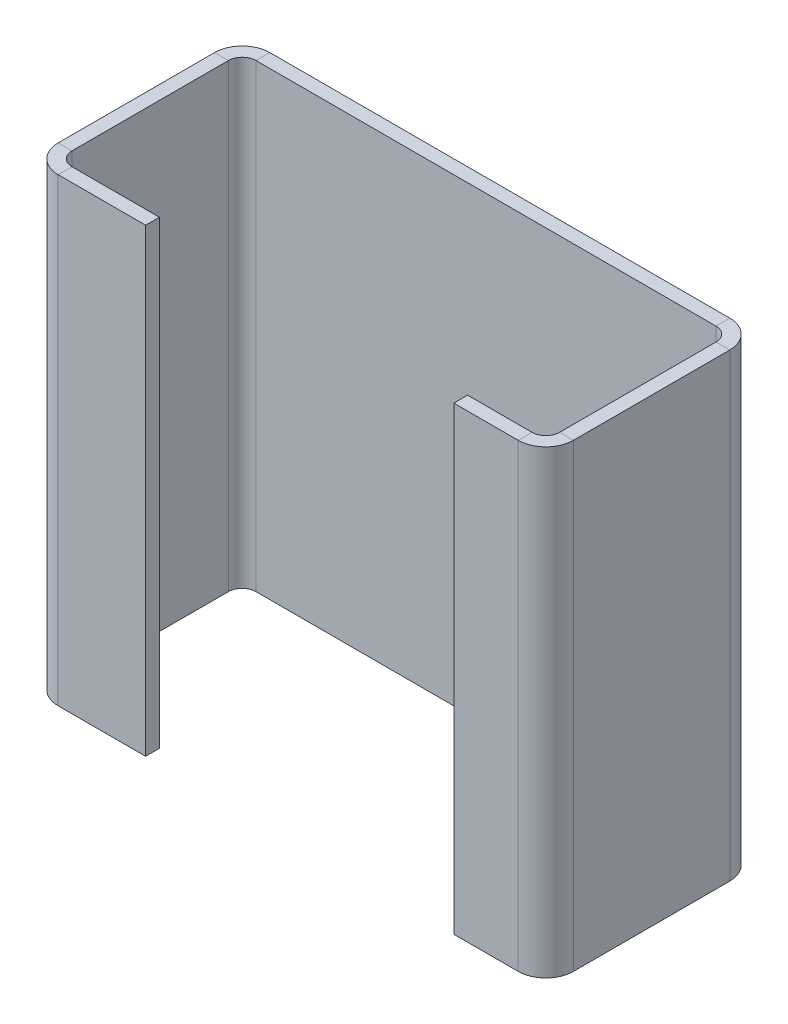
ISO-10303-21;
HEADER;
FILE_DESCRIPTION(('STEP AP214'),'2;1');
FILE_NAME('part.step','',(''),(''),'','','');
FILE_SCHEMA(('AUTOMOTIVE_DESIGN { 1 0 10303 214 1 1 1 1 }'));
ENDSEC;
DATA;
#1=APPLICATION_CONTEXT('core data for automotive mechanical design processes');
#2=APPLICATION_PROTOCOL_DEFINITION('international standard','automotive_design',2000,#1);
#3=PRODUCT_CONTEXT('',#1,'mechanical');
#4=PRODUCT('Part','Part','',(#3));
#5=PRODUCT_RELATED_PRODUCT_CATEGORY('part','',(#4));
#6=PRODUCT_DEFINITION_FORMATION('','',#4);
#7=PRODUCT_DEFINITION_CONTEXT('part definition',#1,'design');
#8=PRODUCT_DEFINITION('design','',#6,#7);
#9=PRODUCT_DEFINITION_SHAPE('','',#8);
#10=(LENGTH_UNIT() NAMED_UNIT(*) SI_UNIT(.MILLI.,.METRE.));
#11=(NAMED_UNIT(*) PLANE_ANGLE_UNIT() SI_UNIT($,.RADIAN.));
#12=(NAMED_UNIT(*) SI_UNIT($,.STERADIAN.) SOLID_ANGLE_UNIT());
#13=UNCERTAINTY_MEASURE_WITH_UNIT(LENGTH_MEASURE(1.E-05),#10,'distance_accuracy_value','');
#14=(GEOMETRIC_REPRESENTATION_CONTEXT(3) GLOBAL_UNCERTAINTY_ASSIGNED_CONTEXT((#13)) GLOBAL_UNIT_ASSIGNED_CONTEXT((#10,
#11,#12)) REPRESENTATION_CONTEXT('',''));
#15=CARTESIAN_POINT('',(0.,0.,0.));
#16=DIRECTION('',(0.,0.,1.));
#17=DIRECTION('',(1.,0.,0.));
#18=AXIS2_PLACEMENT_3D('',#15,#16,#17);
#19=CARTESIAN_POINT('',(-50.,50.,-3.));
#20=DIRECTION('',(0.,1.,0.));
#21=DIRECTION('',(0.,0.,1.));
#22=AXIS2_PLACEMENT_3D('',#19,#20,#21);
#23=PLANE('',#22);
#24=DIRECTION('',(-1.,0.,0.));
#25=VECTOR('',#24,1.);
#26=CARTESIAN_POINT('',(-50.,50.,0.));
#27=LINE('',#26,#25);
#28=CARTESIAN_POINT('',(50.,50.,0.));
#29=VERTEX_POINT('',#28);
#30=CARTESIAN_POINT('',(-50.,50.,0.));
#31=VERTEX_POINT('',#30);
#32=EDGE_CURVE('E161',#29,#31,#27,.T.);
#33=ORIENTED_EDGE('',*,*,#32,.F.);
#34=DIRECTION('',(0.,0.,1.));
#35=VECTOR('',#34,1.);
#36=CARTESIAN_POINT('',(50.,50.,-3.));
#37=LINE('',#36,#35);
#38=CARTESIAN_POINT('',(50.,50.,-3.00000000000003));
#39=VERTEX_POINT('',#38);
#40=EDGE_CURVE('E129',#39,#29,#37,.T.);
#41=ORIENTED_EDGE('',*,*,#40,.F.);
#42=DIRECTION('',(-1.,0.,0.));
#43=VECTOR('',#42,1.);
#44=CARTESIAN_POINT('',(-50.,50.,-3.));
#45=LINE('',#44,#43);
#46=CARTESIAN_POINT('',(-50.,50.,-3.));
#47=VERTEX_POINT('',#46);
#48=EDGE_CURVE('E163',#39,#47,#45,.T.);
#49=ORIENTED_EDGE('',*,*,#48,.T.);
#50=DIRECTION('',(0.,0.,1.));
#51=VECTOR('',#50,1.);
#52=CARTESIAN_POINT('',(-50.,50.,-3.));
#53=LINE('',#52,#51);
#54=EDGE_CURVE('E13',#47,#31,#53,.T.);
#55=ORIENTED_EDGE('',*,*,#54,.T.);
#56=EDGE_LOOP('',(#33,#41,#49,#55));
#57=FACE_BOUND('',#56,.T.);
#58=ADVANCED_FACE('F119',(#57),#23,.T.);
#59=CARTESIAN_POINT('',(-50.,-50.,-3.));
#60=DIRECTION('',(0.,-1.,0.));
#61=DIRECTION('',(1.,0.,0.));
#62=AXIS2_PLACEMENT_3D('',#59,#60,#61);
#63=PLANE('',#62);
#64=DIRECTION('',(1.,0.,0.));
#65=VECTOR('',#64,1.);
#66=CARTESIAN_POINT('',(-50.,-50.,0.));
#67=LINE('',#66,#65);
#68=CARTESIAN_POINT('',(-50.,-50.,0.));
#69=VERTEX_POINT('',#68);
#70=CARTESIAN_POINT('',(50.,-50.,0.));
#71=VERTEX_POINT('',#70);
#72=EDGE_CURVE('E184',#69,#71,#67,.T.);
#73=ORIENTED_EDGE('',*,*,#72,.F.);
#74=DIRECTION('',(0.,0.,1.));
#75=VECTOR('',#74,1.);
#76=CARTESIAN_POINT('',(-50.,-50.,-3.));
#77=LINE('',#76,#75);
#78=CARTESIAN_POINT('',(-50.,-50.,-3.));
#79=VERTEX_POINT('',#78);
#80=EDGE_CURVE('E123',#79,#69,#77,.T.);
#81=ORIENTED_EDGE('',*,*,#80,.F.);
#82=DIRECTION('',(1.,0.,0.));
#83=VECTOR('',#82,1.);
#84=CARTESIAN_POINT('',(-50.,-50.,-3.));
#85=LINE('',#84,#83);
#86=CARTESIAN_POINT('',(50.,-50.,-3.));
#87=VERTEX_POINT('',#86);
#88=EDGE_CURVE('E200',#79,#87,#85,.T.);
#89=ORIENTED_EDGE('',*,*,#88,.T.);
#90=DIRECTION('',(0.,0.,1.));
#91=VECTOR('',#90,1.);
#92=CARTESIAN_POINT('',(50.,-50.,-3.));
#93=LINE('',#92,#91);
#94=EDGE_CURVE('E209',#87,#71,#93,.T.);
#95=ORIENTED_EDGE('',*,*,#94,.T.);
#96=EDGE_LOOP('',(#73,#81,#89,#95));
#97=FACE_BOUND('',#96,.T.);
#98=ADVANCED_FACE('F121',(#97),#63,.T.);
#99=CARTESIAN_POINT('',(0.,0.,-3.));
#100=DIRECTION('',(0.,0.,1.));
#101=DIRECTION('',(1.,0.,0.));
#102=AXIS2_PLACEMENT_3D('',#99,#100,#101);
#103=PLANE('',#102);
#104=DIRECTION('',(0.,-1.,0.));
#105=VECTOR('',#104,1.);
#106=CARTESIAN_POINT('',(-50.,50.,-3.));
#107=LINE('',#106,#105);
#108=EDGE_CURVE('E138',#47,#79,#107,.T.);
#109=ORIENTED_EDGE('',*,*,#108,.F.);
#110=ORIENTED_EDGE('',*,*,#48,.F.);
#111=DIRECTION('',(0.,1.,0.));
#112=VECTOR('',#111,1.);
#113=CARTESIAN_POINT('',(50.,50.,-3.));
#114=LINE('',#113,#112);
#115=EDGE_CURVE('E203',#87,#39,#114,.T.);
#116=ORIENTED_EDGE('',*,*,#115,.F.);
#117=ORIENTED_EDGE('',*,*,#88,.F.);
#118=EDGE_LOOP('',(#109,#110,#116,#117));
#119=FACE_BOUND('',#118,.T.);
#120=ADVANCED_FACE('F543',(#119),#103,.F.);
#121=CARTESIAN_POINT('',(0.,0.,0.));
#122=DIRECTION('',(0.,0.,1.));
#123=DIRECTION('',(1.,0.,0.));
#124=AXIS2_PLACEMENT_3D('',#121,#122,#123);
#125=PLANE('',#124);
#126=DIRECTION('',(0.,-1.,0.));
#127=VECTOR('',#126,1.);
#128=CARTESIAN_POINT('',(-50.,50.,0.));
#129=LINE('',#128,#127);
#130=EDGE_CURVE('E171',#31,#69,#129,.T.);
#131=ORIENTED_EDGE('',*,*,#130,.T.);
#132=ORIENTED_EDGE('',*,*,#72,.T.);
#133=DIRECTION('',(0.,1.,0.));
#134=VECTOR('',#133,1.);
#135=CARTESIAN_POINT('',(50.,50.,0.));
#136=LINE('',#135,#134);
#137=EDGE_CURVE('E156',#71,#29,#136,.T.);
#138=ORIENTED_EDGE('',*,*,#137,.T.);
#139=ORIENTED_EDGE('',*,*,#32,.T.);
#140=EDGE_LOOP('',(#131,#132,#138,#139));
#141=FACE_BOUND('',#140,.T.);
#142=ADVANCED_FACE('F170',(#141),#125,.T.);
#143=CARTESIAN_POINT('',(-50.,50.,3.));
#144=DIRECTION('',(0.,1.,0.));
#145=DIRECTION('',(0.,0.,1.));
#146=AXIS2_PLACEMENT_3D('',#143,#144,#145);
#147=PLANE('',#146);
#148=DIRECTION('',(1.,0.,0.));
#149=VECTOR('',#148,1.);
#150=CARTESIAN_POINT('',(-56.,50.,2.99999999999998));
#151=LINE('',#150,#149);
#152=CARTESIAN_POINT('',(-53.,50.,2.99999999999999));
#153=VERTEX_POINT('',#152);
#154=CARTESIAN_POINT('',(-56.,50.,2.99999999999998));
#155=VERTEX_POINT('',#154);
#156=EDGE_CURVE('E190',#153,#155,#151,.F.);
#157=ORIENTED_EDGE('',*,*,#156,.F.);
#158=CARTESIAN_POINT('',(-50.,50.,3.));
#159=DIRECTION('',(0.,-1.,0.));
#160=DIRECTION('',(0.,0.,-1.));
#161=AXIS2_PLACEMENT_3D('',#158,#159,#160);
#162=CIRCLE('',#161,3.00000000000001);
#163=EDGE_CURVE('E180',#31,#153,#162,.F.);
#164=ORIENTED_EDGE('',*,*,#163,.F.);
#165=ORIENTED_EDGE('',*,*,#54,.F.);
#166=CARTESIAN_POINT('',(-50.,50.,3.));
#167=DIRECTION('',(0.,-1.,0.));
#168=DIRECTION('',(0.,0.,-1.));
#169=AXIS2_PLACEMENT_3D('',#166,#167,#168);
#170=CIRCLE('',#169,6.00000000000001);
#171=EDGE_CURVE('E185',#47,#155,#170,.F.);
#172=ORIENTED_EDGE('',*,*,#171,.T.);
#173=EDGE_LOOP('',(#157,#164,#165,#172));
#174=FACE_BOUND('',#173,.T.);
#175=ADVANCED_FACE('F188',(#174),#147,.T.);
#176=CARTESIAN_POINT('',(-50.,-50.,3.00000000000001));
#177=DIRECTION('',(0.,1.,0.));
#178=DIRECTION('',(0.,0.,1.));
#179=AXIS2_PLACEMENT_3D('',#176,#177,#178);
#180=PLANE('',#179);
#181=CARTESIAN_POINT('',(-50.,-50.,3.00000000000001));
#182=DIRECTION('',(0.,-1.,0.));
#183=DIRECTION('',(0.,0.,-1.));
#184=AXIS2_PLACEMENT_3D('',#181,#182,#183);
#185=CIRCLE('',#184,3.00000000000001);
#186=CARTESIAN_POINT('',(-53.,-50.,3.));
#187=VERTEX_POINT('',#186);
#188=EDGE_CURVE('E183',#187,#69,#185,.T.);
#189=ORIENTED_EDGE('',*,*,#188,.F.);
#190=DIRECTION('',(1.,0.,0.));
#191=VECTOR('',#190,1.);
#192=CARTESIAN_POINT('',(-53.,-50.,3.));
#193=LINE('',#192,#191);
#194=CARTESIAN_POINT('',(-56.,-50.,2.99999999999999));
#195=VERTEX_POINT('',#194);
#196=EDGE_CURVE('E232',#187,#195,#193,.F.);
#197=ORIENTED_EDGE('',*,*,#196,.T.);
#198=CARTESIAN_POINT('',(-50.,-50.,3.00000000000001));
#199=DIRECTION('',(0.,-1.,0.));
#200=DIRECTION('',(0.,0.,-1.));
#201=AXIS2_PLACEMENT_3D('',#198,#199,#200);
#202=CIRCLE('',#201,6.00000000000001);
#203=EDGE_CURVE('E191',#195,#79,#202,.T.);
#204=ORIENTED_EDGE('',*,*,#203,.T.);
#205=ORIENTED_EDGE('',*,*,#80,.T.);
#206=EDGE_LOOP('',(#189,#197,#204,#205));
#207=FACE_BOUND('',#206,.T.);
#208=ADVANCED_FACE('F214',(#207),#180,.F.);
#209=CARTESIAN_POINT('',(-50.,-50.,3.00000000000001));
#210=DIRECTION('',(0.,-1.,0.));
#211=DIRECTION('',(-1.,0.,0.));
#212=AXIS2_PLACEMENT_3D('',#209,#210,#211);
#213=CYLINDRICAL_SURFACE('',#212,6.00000000000001);
#214=ORIENTED_EDGE('',*,*,#108,.T.);
#215=ORIENTED_EDGE('',*,*,#203,.F.);
#216=DIRECTION('',(0.,-1.,0.));
#217=VECTOR('',#216,1.);
#218=CARTESIAN_POINT('',(-56.,50.,2.99999999999998));
#219=LINE('',#218,#217);
#220=EDGE_CURVE('E226',#195,#155,#219,.F.);
#221=ORIENTED_EDGE('',*,*,#220,.T.);
#222=ORIENTED_EDGE('',*,*,#171,.F.);
#223=EDGE_LOOP('',(#214,#215,#221,#222));
#224=FACE_BOUND('',#223,.T.);
#225=ADVANCED_FACE('F222',(#224),#213,.T.);
#226=CARTESIAN_POINT('',(-50.,-50.,3.00000000000001));
#227=DIRECTION('',(0.,-1.,0.));
#228=DIRECTION('',(-1.,0.,0.));
#229=AXIS2_PLACEMENT_3D('',#226,#227,#228);
#230=CYLINDRICAL_SURFACE('',#229,3.00000000000001);
#231=ORIENTED_EDGE('',*,*,#130,.F.);
#232=ORIENTED_EDGE('',*,*,#163,.T.);
#233=DIRECTION('',(0.,-1.,0.));
#234=VECTOR('',#233,1.);
#235=CARTESIAN_POINT('',(-53.,50.,2.99999999999999));
#236=LINE('',#235,#234);
#237=EDGE_CURVE('E229',#153,#187,#236,.T.);
#238=ORIENTED_EDGE('',*,*,#237,.T.);
#239=ORIENTED_EDGE('',*,*,#188,.T.);
#240=EDGE_LOOP('',(#231,#232,#238,#239));
#241=FACE_BOUND('',#240,.T.);
#242=ADVANCED_FACE('F177',(#241),#230,.F.);
#243=CARTESIAN_POINT('',(-56.,50.,0.));
#244=DIRECTION('',(0.,-1.,0.));
#245=DIRECTION('',(1.,0.,0.));
#246=AXIS2_PLACEMENT_3D('',#243,#244,#245);
#247=PLANE('',#246);
#248=ORIENTED_EDGE('',*,*,#156,.T.);
#249=DIRECTION('',(0.,0.,-1.));
#250=VECTOR('',#249,1.);
#251=CARTESIAN_POINT('',(-56.,50.,-1.88635233441175E-13));
#252=LINE('',#251,#250);
#253=CARTESIAN_POINT('',(-56.0000000000001,50.,37.));
#254=VERTEX_POINT('',#253);
#255=EDGE_CURVE('E244',#254,#155,#252,.T.);
#256=ORIENTED_EDGE('',*,*,#255,.F.);
#257=DIRECTION('',(1.,0.,0.));
#258=VECTOR('',#257,1.);
#259=CARTESIAN_POINT('',(-56.0000000000001,50.,37.));
#260=LINE('',#259,#258);
#261=CARTESIAN_POINT('',(-53.0000000000001,50.,37.));
#262=VERTEX_POINT('',#261);
#263=EDGE_CURVE('E253',#254,#262,#260,.T.);
#264=ORIENTED_EDGE('',*,*,#263,.T.);
#265=DIRECTION('',(0.,0.,1.));
#266=VECTOR('',#265,1.);
#267=CARTESIAN_POINT('',(-53.,50.,0.));
#268=LINE('',#267,#266);
#269=EDGE_CURVE('E235',#262,#153,#268,.F.);
#270=ORIENTED_EDGE('',*,*,#269,.T.);
#271=EDGE_LOOP('',(#248,#256,#264,#270));
#272=FACE_BOUND('',#271,.T.);
#273=ADVANCED_FACE('F491',(#272),#247,.F.);
#274=CARTESIAN_POINT('',(-56.0000000000001,-50.,37.));
#275=DIRECTION('',(0.,1.,0.));
#276=DIRECTION('',(-1.,0.,0.));
#277=AXIS2_PLACEMENT_3D('',#274,#275,#276);
#278=PLANE('',#277);
#279=ORIENTED_EDGE('',*,*,#196,.F.);
#280=DIRECTION('',(0.,0.,-1.));
#281=VECTOR('',#280,1.);
#282=CARTESIAN_POINT('',(-53.0000000000001,-50.,37.));
#283=LINE('',#282,#281);
#284=CARTESIAN_POINT('',(-53.0000000000001,-50.,37.));
#285=VERTEX_POINT('',#284);
#286=EDGE_CURVE('E238',#187,#285,#283,.F.);
#287=ORIENTED_EDGE('',*,*,#286,.T.);
#288=DIRECTION('',(1.,0.,0.));
#289=VECTOR('',#288,1.);
#290=CARTESIAN_POINT('',(-56.0000000000001,-50.,37.));
#291=LINE('',#290,#289);
#292=CARTESIAN_POINT('',(-56.0000000000002,-50.,37.));
#293=VERTEX_POINT('',#292);
#294=EDGE_CURVE('E195',#293,#285,#291,.T.);
#295=ORIENTED_EDGE('',*,*,#294,.F.);
#296=DIRECTION('',(0.,0.,1.));
#297=VECTOR('',#296,1.);
#298=CARTESIAN_POINT('',(-56.,-50.,-1.88635233441174E-13));
#299=LINE('',#298,#297);
#300=EDGE_CURVE('E247',#195,#293,#299,.T.);
#301=ORIENTED_EDGE('',*,*,#300,.F.);
#302=EDGE_LOOP('',(#279,#287,#295,#301));
#303=FACE_BOUND('',#302,.T.);
#304=ADVANCED_FACE('F559',(#303),#278,.F.);
#305=CARTESIAN_POINT('',(-56.,0.,-1.88635233441175E-13));
#306=DIRECTION('',(1.,0.,0.));
#307=DIRECTION('',(0.,0.,-1.));
#308=AXIS2_PLACEMENT_3D('',#305,#306,#307);
#309=PLANE('',#308);
#310=ORIENTED_EDGE('',*,*,#220,.F.);
#311=ORIENTED_EDGE('',*,*,#300,.T.);
#312=DIRECTION('',(0.,1.,0.));
#313=VECTOR('',#312,1.);
#314=CARTESIAN_POINT('',(-56.0000000000001,0.,37.));
#315=LINE('',#314,#313);
#316=EDGE_CURVE('E250',#293,#254,#315,.T.);
#317=ORIENTED_EDGE('',*,*,#316,.T.);
#318=ORIENTED_EDGE('',*,*,#255,.T.);
#319=EDGE_LOOP('',(#310,#311,#317,#318));
#320=FACE_BOUND('',#319,.T.);
#321=ADVANCED_FACE('F498',(#320),#309,.F.);
#322=CARTESIAN_POINT('',(-53.,0.,-1.78160789424645E-13));
#323=DIRECTION('',(1.,0.,0.));
#324=DIRECTION('',(0.,0.,-1.));
#325=AXIS2_PLACEMENT_3D('',#322,#323,#324);
#326=PLANE('',#325);
#327=ORIENTED_EDGE('',*,*,#286,.F.);
#328=ORIENTED_EDGE('',*,*,#237,.F.);
#329=ORIENTED_EDGE('',*,*,#269,.F.);
#330=DIRECTION('',(0.,-1.,0.));
#331=VECTOR('',#330,1.);
#332=CARTESIAN_POINT('',(-53.0000000000001,50.,37.));
#333=LINE('',#332,#331);
#334=EDGE_CURVE('E241',#285,#262,#333,.F.);
#335=ORIENTED_EDGE('',*,*,#334,.F.);
#336=EDGE_LOOP('',(#327,#328,#329,#335));
#337=FACE_BOUND('',#336,.T.);
#338=ADVANCED_FACE('F488',(#337),#326,.T.);
#339=CARTESIAN_POINT('',(50.,-50.,3.));
#340=DIRECTION('',(0.,-1.,0.));
#341=DIRECTION('',(0.,0.,-1.));
#342=AXIS2_PLACEMENT_3D('',#339,#340,#341);
#343=PLANE('',#342);
#344=DIRECTION('',(1.,0.,0.));
#345=VECTOR('',#344,1.);
#346=CARTESIAN_POINT('',(56.,-50.,2.99999999999998));
#347=LINE('',#346,#345);
#348=CARTESIAN_POINT('',(53.,-50.,2.99999999999999));
#349=VERTEX_POINT('',#348);
#350=CARTESIAN_POINT('',(56.,-50.,2.99999999999998));
#351=VERTEX_POINT('',#350);
#352=EDGE_CURVE('E270',#349,#351,#347,.T.);
#353=ORIENTED_EDGE('',*,*,#352,.F.);
#354=CARTESIAN_POINT('',(50.,-50.,3.));
#355=DIRECTION('',(0.,1.,0.));
#356=DIRECTION('',(0.,0.,1.));
#357=AXIS2_PLACEMENT_3D('',#354,#355,#356);
#358=CIRCLE('',#357,3.00000000000001);
#359=EDGE_CURVE('E261',#71,#349,#358,.F.);
#360=ORIENTED_EDGE('',*,*,#359,.F.);
#361=ORIENTED_EDGE('',*,*,#94,.F.);
#362=CARTESIAN_POINT('',(50.,-50.,3.));
#363=DIRECTION('',(0.,1.,0.));
#364=DIRECTION('',(0.,0.,1.));
#365=AXIS2_PLACEMENT_3D('',#362,#363,#364);
#366=CIRCLE('',#365,6.00000000000001);
#367=EDGE_CURVE('E230',#87,#351,#366,.F.);
#368=ORIENTED_EDGE('',*,*,#367,.T.);
#369=EDGE_LOOP('',(#353,#360,#361,#368));
#370=FACE_BOUND('',#369,.T.);
#371=ADVANCED_FACE('F565',(#370),#343,.T.);
#372=CARTESIAN_POINT('',(50.,50.,2.99999999999998));
#373=DIRECTION('',(0.,-1.,0.));
#374=DIRECTION('',(0.,0.,-1.));
#375=AXIS2_PLACEMENT_3D('',#372,#373,#374);
#376=PLANE('',#375);
#377=CARTESIAN_POINT('',(50.,50.,2.99999999999998));
#378=DIRECTION('',(0.,1.,0.));
#379=DIRECTION('',(0.,0.,1.));
#380=AXIS2_PLACEMENT_3D('',#377,#378,#379);
#381=CIRCLE('',#380,3.00000000000001);
#382=CARTESIAN_POINT('',(53.,50.,2.99999999999997));
#383=VERTEX_POINT('',#382);
#384=EDGE_CURVE('E258',#383,#29,#381,.T.);
#385=ORIENTED_EDGE('',*,*,#384,.F.);
#386=DIRECTION('',(1.,0.,0.));
#387=VECTOR('',#386,1.);
#388=CARTESIAN_POINT('',(53.,50.,2.99999999999998));
#389=LINE('',#388,#387);
#390=CARTESIAN_POINT('',(56.,50.,2.99999999999997));
#391=VERTEX_POINT('',#390);
#392=EDGE_CURVE('E277',#383,#391,#389,.T.);
#393=ORIENTED_EDGE('',*,*,#392,.T.);
#394=CARTESIAN_POINT('',(50.,50.,2.99999999999998));
#395=DIRECTION('',(0.,1.,0.));
#396=DIRECTION('',(0.,0.,1.));
#397=AXIS2_PLACEMENT_3D('',#394,#395,#396);
#398=CIRCLE('',#397,6.00000000000001);
#399=EDGE_CURVE('E265',#391,#39,#398,.T.);
#400=ORIENTED_EDGE('',*,*,#399,.T.);
#401=ORIENTED_EDGE('',*,*,#40,.T.);
#402=EDGE_LOOP('',(#385,#393,#400,#401));
#403=FACE_BOUND('',#402,.T.);
#404=ADVANCED_FACE('F568',(#403),#376,.F.);
#405=CARTESIAN_POINT('',(50.,50.,2.99999999999998));
#406=DIRECTION('',(0.,1.,0.));
#407=DIRECTION('',(1.,0.,0.));
#408=AXIS2_PLACEMENT_3D('',#405,#406,#407);
#409=CYLINDRICAL_SURFACE('',#408,6.00000000000001);
#410=ORIENTED_EDGE('',*,*,#115,.T.);
#411=ORIENTED_EDGE('',*,*,#399,.F.);
#412=DIRECTION('',(0.,1.,0.));
#413=VECTOR('',#412,1.);
#414=CARTESIAN_POINT('',(56.,0.,2.99999999999997));
#415=LINE('',#414,#413);
#416=EDGE_CURVE('E280',#351,#391,#415,.T.);
#417=ORIENTED_EDGE('',*,*,#416,.F.);
#418=ORIENTED_EDGE('',*,*,#367,.F.);
#419=EDGE_LOOP('',(#410,#411,#417,#418));
#420=FACE_BOUND('',#419,.T.);
#421=ADVANCED_FACE('F571',(#420),#409,.T.);
#422=CARTESIAN_POINT('',(50.,50.,2.99999999999998));
#423=DIRECTION('',(0.,1.,0.));
#424=DIRECTION('',(1.,0.,0.));
#425=AXIS2_PLACEMENT_3D('',#422,#423,#424);
#426=CYLINDRICAL_SURFACE('',#425,3.00000000000001);
#427=ORIENTED_EDGE('',*,*,#137,.F.);
#428=ORIENTED_EDGE('',*,*,#359,.T.);
#429=DIRECTION('',(0.,-1.,0.));
#430=VECTOR('',#429,1.);
#431=CARTESIAN_POINT('',(53.,-50.,2.99999999999999));
#432=LINE('',#431,#430);
#433=EDGE_CURVE('E273',#349,#383,#432,.F.);
#434=ORIENTED_EDGE('',*,*,#433,.T.);
#435=ORIENTED_EDGE('',*,*,#384,.T.);
#436=EDGE_LOOP('',(#427,#428,#434,#435));
#437=FACE_BOUND('',#436,.T.);
#438=ADVANCED_FACE('F576',(#437),#426,.F.);
#439=CARTESIAN_POINT('',(56.,50.,0.));
#440=DIRECTION('',(0.,1.,0.));
#441=DIRECTION('',(-1.,0.,0.));
#442=AXIS2_PLACEMENT_3D('',#439,#440,#441);
#443=PLANE('',#442);
#444=DIRECTION('',(0.,0.,-1.));
#445=VECTOR('',#444,1.);
#446=CARTESIAN_POINT('',(56.,50.,0.));
#447=LINE('',#446,#445);
#448=CARTESIAN_POINT('',(56.0000000000001,50.,37.));
#449=VERTEX_POINT('',#448);
#450=EDGE_CURVE('E298',#449,#391,#447,.T.);
#451=ORIENTED_EDGE('',*,*,#450,.T.);
#452=ORIENTED_EDGE('',*,*,#392,.F.);
#453=DIRECTION('',(0.,0.,1.));
#454=VECTOR('',#453,1.);
#455=CARTESIAN_POINT('',(53.,50.,-1.68783905770716E-13));
#456=LINE('',#455,#454);
#457=CARTESIAN_POINT('',(53.0000000000001,50.,37.));
#458=VERTEX_POINT('',#457);
#459=EDGE_CURVE('E289',#458,#383,#456,.F.);
#460=ORIENTED_EDGE('',*,*,#459,.F.);
#461=DIRECTION('',(-1.,0.,0.));
#462=VECTOR('',#461,1.);
#463=CARTESIAN_POINT('',(56.0000000000001,50.,37.));
#464=LINE('',#463,#462);
#465=EDGE_CURVE('E262',#449,#458,#464,.T.);
#466=ORIENTED_EDGE('',*,*,#465,.F.);
#467=EDGE_LOOP('',(#451,#452,#460,#466));
#468=FACE_BOUND('',#467,.T.);
#469=ADVANCED_FACE('F579',(#468),#443,.T.);
#470=CARTESIAN_POINT('',(56.0000000000001,-50.,37.));
#471=DIRECTION('',(0.,-1.,0.));
#472=DIRECTION('',(1.,0.,0.));
#473=AXIS2_PLACEMENT_3D('',#470,#471,#472);
#474=PLANE('',#473);
#475=DIRECTION('',(0.,0.,-1.));
#476=VECTOR('',#475,1.);
#477=CARTESIAN_POINT('',(53.,-50.,-1.68783905770716E-13));
#478=LINE('',#477,#476);
#479=CARTESIAN_POINT('',(53.0000000000001,-50.,37.));
#480=VERTEX_POINT('',#479);
#481=EDGE_CURVE('E283',#349,#480,#478,.F.);
#482=ORIENTED_EDGE('',*,*,#481,.F.);
#483=ORIENTED_EDGE('',*,*,#352,.T.);
#484=DIRECTION('',(0.,0.,1.));
#485=VECTOR('',#484,1.);
#486=CARTESIAN_POINT('',(56.0000000000001,-50.,37.));
#487=LINE('',#486,#485);
#488=CARTESIAN_POINT('',(56.0000000000001,-50.,37.));
#489=VERTEX_POINT('',#488);
#490=EDGE_CURVE('E292',#351,#489,#487,.T.);
#491=ORIENTED_EDGE('',*,*,#490,.T.);
#492=DIRECTION('',(-1.,0.,0.));
#493=VECTOR('',#492,1.);
#494=CARTESIAN_POINT('',(56.0000000000001,-50.,37.));
#495=LINE('',#494,#493);
#496=EDGE_CURVE('E301',#489,#480,#495,.T.);
#497=ORIENTED_EDGE('',*,*,#496,.T.);
#498=EDGE_LOOP('',(#482,#483,#491,#497));
#499=FACE_BOUND('',#498,.T.);
#500=ADVANCED_FACE('F584',(#499),#474,.T.);
#501=CARTESIAN_POINT('',(56.,0.,-1.79258349787246E-13));
#502=DIRECTION('',(1.,0.,0.));
#503=DIRECTION('',(0.,0.,-1.));
#504=AXIS2_PLACEMENT_3D('',#501,#502,#503);
#505=PLANE('',#504);
#506=ORIENTED_EDGE('',*,*,#490,.F.);
#507=ORIENTED_EDGE('',*,*,#416,.T.);
#508=ORIENTED_EDGE('',*,*,#450,.F.);
#509=DIRECTION('',(0.,1.,0.));
#510=VECTOR('',#509,1.);
#511=CARTESIAN_POINT('',(56.0000000000001,50.,37.));
#512=LINE('',#511,#510);
#513=EDGE_CURVE('E295',#489,#449,#512,.T.);
#514=ORIENTED_EDGE('',*,*,#513,.F.);
#515=EDGE_LOOP('',(#506,#507,#508,#514));
#516=FACE_BOUND('',#515,.T.);
#517=ADVANCED_FACE('F587',(#516),#505,.T.);
#518=CARTESIAN_POINT('',(53.,0.,-1.68783905770716E-13));
#519=DIRECTION('',(1.,0.,0.));
#520=DIRECTION('',(0.,0.,-1.));
#521=AXIS2_PLACEMENT_3D('',#518,#519,#520);
#522=PLANE('',#521);
#523=ORIENTED_EDGE('',*,*,#433,.F.);
#524=ORIENTED_EDGE('',*,*,#481,.T.);
#525=DIRECTION('',(0.,-1.,0.));
#526=VECTOR('',#525,1.);
#527=CARTESIAN_POINT('',(53.0000000000001,0.,37.));
#528=LINE('',#527,#526);
#529=EDGE_CURVE('E286',#480,#458,#528,.F.);
#530=ORIENTED_EDGE('',*,*,#529,.T.);
#531=ORIENTED_EDGE('',*,*,#459,.T.);
#532=EDGE_LOOP('',(#523,#524,#530,#531));
#533=FACE_BOUND('',#532,.T.);
#534=ADVANCED_FACE('F592',(#533),#522,.F.);
#535=CARTESIAN_POINT('',(-50.0000000000002,50.,37.));
#536=DIRECTION('',(0.,1.,0.));
#537=DIRECTION('',(0.,0.,1.));
#538=AXIS2_PLACEMENT_3D('',#535,#536,#537);
#539=PLANE('',#538);
#540=DIRECTION('',(0.,0.,-1.));
#541=VECTOR('',#540,1.);
#542=CARTESIAN_POINT('',(-50.0000000000002,50.,43.));
#543=LINE('',#542,#541);
#544=CARTESIAN_POINT('',(-50.0000000000002,50.,40.));
#545=VERTEX_POINT('',#544);
#546=CARTESIAN_POINT('',(-50.0000000000002,50.,43.));
#547=VERTEX_POINT('',#546);
#548=EDGE_CURVE('E318',#545,#547,#543,.F.);
#549=ORIENTED_EDGE('',*,*,#548,.F.);
#550=CARTESIAN_POINT('',(-50.0000000000002,50.,37.));
#551=DIRECTION('',(0.,-1.,0.));
#552=DIRECTION('',(0.,0.,-1.));
#553=AXIS2_PLACEMENT_3D('',#550,#551,#552);
#554=CIRCLE('',#553,3.);
#555=EDGE_CURVE('E309',#262,#545,#554,.F.);
#556=ORIENTED_EDGE('',*,*,#555,.F.);
#557=ORIENTED_EDGE('',*,*,#263,.F.);
#558=CARTESIAN_POINT('',(-50.0000000000002,50.,37.));
#559=DIRECTION('',(0.,-1.,0.));
#560=DIRECTION('',(0.,0.,-1.));
#561=AXIS2_PLACEMENT_3D('',#558,#559,#560);
#562=CIRCLE('',#561,6.);
#563=EDGE_CURVE('E274',#254,#547,#562,.F.);
#564=ORIENTED_EDGE('',*,*,#563,.T.);
#565=EDGE_LOOP('',(#549,#556,#557,#564));
#566=FACE_BOUND('',#565,.T.);
#567=ADVANCED_FACE('F496',(#566),#539,.T.);
#568=CARTESIAN_POINT('',(-50.0000000000002,-50.,37.));
#569=DIRECTION('',(0.,1.,0.));
#570=DIRECTION('',(0.,0.,1.));
#571=AXIS2_PLACEMENT_3D('',#568,#569,#570);
#572=PLANE('',#571);
#573=CARTESIAN_POINT('',(-50.0000000000002,-50.,37.));
#574=DIRECTION('',(0.,-1.,0.));
#575=DIRECTION('',(0.,0.,-1.));
#576=AXIS2_PLACEMENT_3D('',#573,#574,#575);
#577=CIRCLE('',#576,3.);
#578=CARTESIAN_POINT('',(-50.0000000000002,-50.,40.));
#579=VERTEX_POINT('',#578);
#580=EDGE_CURVE('E306',#579,#285,#577,.T.);
#581=ORIENTED_EDGE('',*,*,#580,.F.);
#582=DIRECTION('',(0.,0.,-1.));
#583=VECTOR('',#582,1.);
#584=CARTESIAN_POINT('',(-50.0000000000001,-50.,40.));
#585=LINE('',#584,#583);
#586=CARTESIAN_POINT('',(-50.0000000000001,-50.,43.));
#587=VERTEX_POINT('',#586);
#588=EDGE_CURVE('E325',#579,#587,#585,.F.);
#589=ORIENTED_EDGE('',*,*,#588,.T.);
#590=CARTESIAN_POINT('',(-50.0000000000002,-50.,37.));
#591=DIRECTION('',(0.,-1.,0.));
#592=DIRECTION('',(0.,0.,-1.));
#593=AXIS2_PLACEMENT_3D('',#590,#591,#592);
#594=CIRCLE('',#593,6.);
#595=EDGE_CURVE('E313',#587,#293,#594,.T.);
#596=ORIENTED_EDGE('',*,*,#595,.T.);
#597=ORIENTED_EDGE('',*,*,#294,.T.);
#598=EDGE_LOOP('',(#581,#589,#596,#597));
#599=FACE_BOUND('',#598,.T.);
#600=ADVANCED_FACE('F505',(#599),#572,.F.);
#601=CARTESIAN_POINT('',(-50.0000000000002,-50.,37.));
#602=DIRECTION('',(0.,-1.,0.));
#603=DIRECTION('',(0.,0.,1.));
#604=AXIS2_PLACEMENT_3D('',#601,#602,#603);
#605=CYLINDRICAL_SURFACE('',#604,6.);
#606=ORIENTED_EDGE('',*,*,#316,.F.);
#607=ORIENTED_EDGE('',*,*,#595,.F.);
#608=DIRECTION('',(0.,-1.,0.));
#609=VECTOR('',#608,1.);
#610=CARTESIAN_POINT('',(-50.0000000000002,50.,43.));
#611=LINE('',#610,#609);
#612=EDGE_CURVE('E328',#587,#547,#611,.F.);
#613=ORIENTED_EDGE('',*,*,#612,.T.);
#614=ORIENTED_EDGE('',*,*,#563,.F.);
#615=EDGE_LOOP('',(#606,#607,#613,#614));
#616=FACE_BOUND('',#615,.T.);
#617=ADVANCED_FACE('F502',(#616),#605,.T.);
#618=CARTESIAN_POINT('',(-50.0000000000002,-50.,37.));
#619=DIRECTION('',(0.,-1.,0.));
#620=DIRECTION('',(0.,0.,1.));
#621=AXIS2_PLACEMENT_3D('',#618,#619,#620);
#622=CYLINDRICAL_SURFACE('',#621,3.);
#623=ORIENTED_EDGE('',*,*,#334,.T.);
#624=ORIENTED_EDGE('',*,*,#555,.T.);
#625=DIRECTION('',(0.,-1.,0.));
#626=VECTOR('',#625,1.);
#627=CARTESIAN_POINT('',(-50.0000000000002,50.,40.));
#628=LINE('',#627,#626);
#629=EDGE_CURVE('E321',#545,#579,#628,.T.);
#630=ORIENTED_EDGE('',*,*,#629,.T.);
#631=ORIENTED_EDGE('',*,*,#580,.T.);
#632=EDGE_LOOP('',(#623,#624,#630,#631));
#633=FACE_BOUND('',#632,.T.);
#634=ADVANCED_FACE('F526',(#633),#622,.F.);
#635=CARTESIAN_POINT('',(-31.0000000000002,-50.,43.0000000000001));
#636=DIRECTION('',(0.,1.,0.));
#637=DIRECTION('',(0.,0.,1.));
#638=AXIS2_PLACEMENT_3D('',#635,#636,#637);
#639=PLANE('',#638);
#640=ORIENTED_EDGE('',*,*,#588,.F.);
#641=DIRECTION('',(-1.,0.,0.));
#642=VECTOR('',#641,1.);
#643=CARTESIAN_POINT('',(-31.0000000000001,-50.,40.0000000000001));
#644=LINE('',#643,#642);
#645=CARTESIAN_POINT('',(-31.0000000000001,-50.,40.0000000000001));
#646=VERTEX_POINT('',#645);
#647=EDGE_CURVE('E331',#579,#646,#644,.F.);
#648=ORIENTED_EDGE('',*,*,#647,.T.);
#649=DIRECTION('',(0.,0.,-1.));
#650=VECTOR('',#649,1.);
#651=CARTESIAN_POINT('',(-31.0000000000002,-50.,43.0000000000001));
#652=LINE('',#651,#650);
#653=CARTESIAN_POINT('',(-31.0000000000002,-50.,43.0000000000001));
#654=VERTEX_POINT('',#653);
#655=EDGE_CURVE('E310',#654,#646,#652,.T.);
#656=ORIENTED_EDGE('',*,*,#655,.F.);
#657=DIRECTION('',(1.,0.,0.));
#658=VECTOR('',#657,1.);
#659=CARTESIAN_POINT('',(-2.88592813192057E-13,-50.,43.0000000000003));
#660=LINE('',#659,#658);
#661=EDGE_CURVE('E340',#587,#654,#660,.T.);
#662=ORIENTED_EDGE('',*,*,#661,.F.);
#663=EDGE_LOOP('',(#640,#648,#656,#662));
#664=FACE_BOUND('',#663,.T.);
#665=ADVANCED_FACE('F516',(#664),#639,.F.);
#666=CARTESIAN_POINT('',(-53.0000000000002,50.,43.));
#667=DIRECTION('',(0.,-1.,0.));
#668=DIRECTION('',(0.,0.,-1.));
#669=AXIS2_PLACEMENT_3D('',#666,#667,#668);
#670=PLANE('',#669);
#671=ORIENTED_EDGE('',*,*,#548,.T.);
#672=DIRECTION('',(-1.,0.,0.));
#673=VECTOR('',#672,1.);
#674=CARTESIAN_POINT('',(-2.88592813192057E-13,50.,43.0000000000003));
#675=LINE('',#674,#673);
#676=CARTESIAN_POINT('',(-31.0000000000002,50.,43.0000000000001));
#677=VERTEX_POINT('',#676);
#678=EDGE_CURVE('E346',#677,#547,#675,.T.);
#679=ORIENTED_EDGE('',*,*,#678,.F.);
#680=DIRECTION('',(0.,0.,-1.));
#681=VECTOR('',#680,1.);
#682=CARTESIAN_POINT('',(-31.0000000000002,50.,43.0000000000001));
#683=LINE('',#682,#681);
#684=CARTESIAN_POINT('',(-31.0000000000002,50.,40.0000000000001));
#685=VERTEX_POINT('',#684);
#686=EDGE_CURVE('E349',#677,#685,#683,.T.);
#687=ORIENTED_EDGE('',*,*,#686,.T.);
#688=DIRECTION('',(1.,0.,0.));
#689=VECTOR('',#688,1.);
#690=CARTESIAN_POINT('',(-53.0000000000001,50.,40.));
#691=LINE('',#690,#689);
#692=EDGE_CURVE('E337',#685,#545,#691,.F.);
#693=ORIENTED_EDGE('',*,*,#692,.T.);
#694=EDGE_LOOP('',(#671,#679,#687,#693));
#695=FACE_BOUND('',#694,.T.);
#696=ADVANCED_FACE('F523',(#695),#670,.F.);
#697=CARTESIAN_POINT('',(-2.88592813192057E-13,0.,43.0000000000003));
#698=DIRECTION('',(0.,0.,-1.));
#699=DIRECTION('',(-1.,0.,0.));
#700=AXIS2_PLACEMENT_3D('',#697,#698,#699);
#701=PLANE('',#700);
#702=ORIENTED_EDGE('',*,*,#612,.F.);
#703=ORIENTED_EDGE('',*,*,#661,.T.);
#704=DIRECTION('',(0.,1.,0.));
#705=VECTOR('',#704,1.);
#706=CARTESIAN_POINT('',(-31.0000000000002,0.,43.0000000000001));
#707=LINE('',#706,#705);
#708=EDGE_CURVE('E343',#654,#677,#707,.T.);
#709=ORIENTED_EDGE('',*,*,#708,.T.);
#710=ORIENTED_EDGE('',*,*,#678,.T.);
#711=EDGE_LOOP('',(#702,#703,#709,#710));
#712=FACE_BOUND('',#711,.T.);
#713=ADVANCED_FACE('F512',(#712),#701,.F.);
#714=CARTESIAN_POINT('',(-2.67428721810049E-13,0.,40.0000000000003));
#715=DIRECTION('',(0.,0.,-1.));
#716=DIRECTION('',(-1.,0.,0.));
#717=AXIS2_PLACEMENT_3D('',#714,#715,#716);
#718=PLANE('',#717);
#719=ORIENTED_EDGE('',*,*,#647,.F.);
#720=ORIENTED_EDGE('',*,*,#629,.F.);
#721=ORIENTED_EDGE('',*,*,#692,.F.);
#722=DIRECTION('',(0.,-1.,0.));
#723=VECTOR('',#722,1.);
#724=CARTESIAN_POINT('',(-31.0000000000002,50.,40.0000000000001));
#725=LINE('',#724,#723);
#726=EDGE_CURVE('E334',#646,#685,#725,.F.);
#727=ORIENTED_EDGE('',*,*,#726,.F.);
#728=EDGE_LOOP('',(#719,#720,#721,#727));
#729=FACE_BOUND('',#728,.T.);
#730=ADVANCED_FACE('F528',(#729),#718,.T.);
#731=CARTESIAN_POINT('',(-31.0000000000002,50.,43.0000000000001));
#732=DIRECTION('',(-1.,0.,0.));
#733=DIRECTION('',(0.,0.,1.));
#734=AXIS2_PLACEMENT_3D('',#731,#732,#733);
#735=PLANE('',#734);
#736=ORIENTED_EDGE('',*,*,#726,.T.);
#737=ORIENTED_EDGE('',*,*,#686,.F.);
#738=ORIENTED_EDGE('',*,*,#708,.F.);
#739=ORIENTED_EDGE('',*,*,#655,.T.);
#740=EDGE_LOOP('',(#736,#737,#738,#739));
#741=FACE_BOUND('',#740,.T.);
#742=ADVANCED_FACE('F519',(#741),#735,.F.);
#743=CARTESIAN_POINT('',(50.0000000000001,-50.,37.));
#744=DIRECTION('',(0.,-1.,0.));
#745=DIRECTION('',(0.,0.,-1.));
#746=AXIS2_PLACEMENT_3D('',#743,#744,#745);
#747=PLANE('',#746);
#748=DIRECTION('',(0.,0.,-1.));
#749=VECTOR('',#748,1.);
#750=CARTESIAN_POINT('',(50.0000000000001,-50.,43.));
#751=LINE('',#750,#749);
#752=CARTESIAN_POINT('',(50.0000000000001,-50.,40.));
#753=VERTEX_POINT('',#752);
#754=CARTESIAN_POINT('',(50.0000000000002,-50.,43.));
#755=VERTEX_POINT('',#754);
#756=EDGE_CURVE('E366',#753,#755,#751,.F.);
#757=ORIENTED_EDGE('',*,*,#756,.F.);
#758=CARTESIAN_POINT('',(50.0000000000001,-50.,37.));
#759=DIRECTION('',(0.,1.,0.));
#760=DIRECTION('',(0.,0.,1.));
#761=AXIS2_PLACEMENT_3D('',#758,#759,#760);
#762=CIRCLE('',#761,3.);
#763=EDGE_CURVE('E357',#480,#753,#762,.F.);
#764=ORIENTED_EDGE('',*,*,#763,.F.);
#765=ORIENTED_EDGE('',*,*,#496,.F.);
#766=CARTESIAN_POINT('',(50.0000000000001,-50.,37.));
#767=DIRECTION('',(0.,1.,0.));
#768=DIRECTION('',(0.,0.,1.));
#769=AXIS2_PLACEMENT_3D('',#766,#767,#768);
#770=CIRCLE('',#769,6.);
#771=EDGE_CURVE('E322',#489,#755,#770,.F.);
#772=ORIENTED_EDGE('',*,*,#771,.T.);
#773=EDGE_LOOP('',(#757,#764,#765,#772));
#774=FACE_BOUND('',#773,.T.);
#775=ADVANCED_FACE('F535',(#774),#747,.T.);
#776=CARTESIAN_POINT('',(50.0000000000001,50.,37.));
#777=DIRECTION('',(0.,-1.,0.));
#778=DIRECTION('',(0.,0.,-1.));
#779=AXIS2_PLACEMENT_3D('',#776,#777,#778);
#780=PLANE('',#779);
#781=CARTESIAN_POINT('',(50.0000000000001,50.,37.));
#782=DIRECTION('',(0.,1.,0.));
#783=DIRECTION('',(0.,0.,1.));
#784=AXIS2_PLACEMENT_3D('',#781,#782,#783);
#785=CIRCLE('',#784,3.);
#786=CARTESIAN_POINT('',(50.0000000000001,50.,40.));
#787=VERTEX_POINT('',#786);
#788=EDGE_CURVE('E354',#787,#458,#785,.T.);
#789=ORIENTED_EDGE('',*,*,#788,.F.);
#790=DIRECTION('',(0.,0.,-1.));
#791=VECTOR('',#790,1.);
#792=CARTESIAN_POINT('',(50.0000000000001,50.,40.));
#793=LINE('',#792,#791);
#794=CARTESIAN_POINT('',(50.0000000000001,50.,43.));
#795=VERTEX_POINT('',#794);
#796=EDGE_CURVE('E372',#787,#795,#793,.F.);
#797=ORIENTED_EDGE('',*,*,#796,.T.);
#798=CARTESIAN_POINT('',(50.0000000000001,50.,37.));
#799=DIRECTION('',(0.,1.,0.));
#800=DIRECTION('',(0.,0.,1.));
#801=AXIS2_PLACEMENT_3D('',#798,#799,#800);
#802=CIRCLE('',#801,6.);
#803=EDGE_CURVE('E361',#795,#449,#802,.T.);
#804=ORIENTED_EDGE('',*,*,#803,.T.);
#805=ORIENTED_EDGE('',*,*,#465,.T.);
#806=EDGE_LOOP('',(#789,#797,#804,#805));
#807=FACE_BOUND('',#806,.T.);
#808=ADVANCED_FACE('F669',(#807),#780,.F.);
#809=CARTESIAN_POINT('',(50.0000000000001,50.,37.));
#810=DIRECTION('',(0.,1.,0.));
#811=DIRECTION('',(0.,0.,1.));
#812=AXIS2_PLACEMENT_3D('',#809,#810,#811);
#813=CYLINDRICAL_SURFACE('',#812,6.);
#814=ORIENTED_EDGE('',*,*,#513,.T.);
#815=ORIENTED_EDGE('',*,*,#803,.F.);
#816=DIRECTION('',(0.,1.,0.));
#817=VECTOR('',#816,1.);
#818=CARTESIAN_POINT('',(50.0000000000001,-50.,43.));
#819=LINE('',#818,#817);
#820=EDGE_CURVE('E375',#795,#755,#819,.F.);
#821=ORIENTED_EDGE('',*,*,#820,.T.);
#822=ORIENTED_EDGE('',*,*,#771,.F.);
#823=EDGE_LOOP('',(#814,#815,#821,#822));
#824=FACE_BOUND('',#823,.T.);
#825=ADVANCED_FACE('F679',(#824),#813,.T.);
#826=CARTESIAN_POINT('',(50.0000000000001,50.,37.));
#827=DIRECTION('',(0.,1.,0.));
#828=DIRECTION('',(0.,0.,1.));
#829=AXIS2_PLACEMENT_3D('',#826,#827,#828);
#830=CYLINDRICAL_SURFACE('',#829,3.);
#831=ORIENTED_EDGE('',*,*,#529,.F.);
#832=ORIENTED_EDGE('',*,*,#763,.T.);
#833=DIRECTION('',(0.,1.,0.));
#834=VECTOR('',#833,1.);
#835=CARTESIAN_POINT('',(50.0000000000001,-50.,40.));
#836=LINE('',#835,#834);
#837=EDGE_CURVE('E369',#753,#787,#836,.T.);
#838=ORIENTED_EDGE('',*,*,#837,.T.);
#839=ORIENTED_EDGE('',*,*,#788,.T.);
#840=EDGE_LOOP('',(#831,#832,#838,#839));
#841=FACE_BOUND('',#840,.T.);
#842=ADVANCED_FACE('F690',(#841),#830,.F.);
#843=CARTESIAN_POINT('',(53.0000000000001,-50.,43.));
#844=DIRECTION('',(0.,1.,0.));
#845=DIRECTION('',(-1.,0.,0.));
#846=AXIS2_PLACEMENT_3D('',#843,#844,#845);
#847=PLANE('',#846);
#848=ORIENTED_EDGE('',*,*,#756,.T.);
#849=DIRECTION('',(1.,0.,0.));
#850=VECTOR('',#849,1.);
#851=CARTESIAN_POINT('',(3.28284610117746E-13,-50.,43.0000000000003));
#852=LINE('',#851,#850);
#853=CARTESIAN_POINT('',(36.0000000000002,-50.,43.0000000000001));
#854=VERTEX_POINT('',#853);
#855=EDGE_CURVE('E387',#854,#755,#852,.T.);
#856=ORIENTED_EDGE('',*,*,#855,.F.);
#857=DIRECTION('',(0.,0.,-1.));
#858=VECTOR('',#857,1.);
#859=CARTESIAN_POINT('',(36.0000000000002,-50.,43.0000000000001));
#860=LINE('',#859,#858);
#861=CARTESIAN_POINT('',(36.0000000000001,-50.,40.0000000000001));
#862=VERTEX_POINT('',#861);
#863=EDGE_CURVE('E396',#854,#862,#860,.T.);
#864=ORIENTED_EDGE('',*,*,#863,.T.);
#865=DIRECTION('',(-1.,0.,0.));
#866=VECTOR('',#865,1.);
#867=CARTESIAN_POINT('',(53.0000000000001,-50.,40.));
#868=LINE('',#867,#866);
#869=EDGE_CURVE('E378',#862,#753,#868,.F.);
#870=ORIENTED_EDGE('',*,*,#869,.T.);
#871=EDGE_LOOP('',(#848,#856,#864,#870));
#872=FACE_BOUND('',#871,.T.);
#873=ADVANCED_FACE('F422',(#872),#847,.F.);
#874=CARTESIAN_POINT('',(36.0000000000001,50.,43.0000000000001));
#875=DIRECTION('',(0.,-1.,0.));
#876=DIRECTION('',(1.,0.,0.));
#877=AXIS2_PLACEMENT_3D('',#874,#875,#876);
#878=PLANE('',#877);
#879=ORIENTED_EDGE('',*,*,#796,.F.);
#880=DIRECTION('',(1.,0.,0.));
#881=VECTOR('',#880,1.);
#882=CARTESIAN_POINT('',(36.0000000000001,50.,40.0000000000001));
#883=LINE('',#882,#881);
#884=CARTESIAN_POINT('',(36.0000000000001,50.,40.0000000000001));
#885=VERTEX_POINT('',#884);
#886=EDGE_CURVE('E381',#787,#885,#883,.F.);
#887=ORIENTED_EDGE('',*,*,#886,.T.);
#888=DIRECTION('',(0.,0.,-1.));
#889=VECTOR('',#888,1.);
#890=CARTESIAN_POINT('',(36.0000000000001,50.,43.0000000000001));
#891=LINE('',#890,#889);
#892=CARTESIAN_POINT('',(36.0000000000001,50.,43.0000000000001));
#893=VERTEX_POINT('',#892);
#894=EDGE_CURVE('E358',#893,#885,#891,.T.);
#895=ORIENTED_EDGE('',*,*,#894,.F.);
#896=DIRECTION('',(-1.,0.,0.));
#897=VECTOR('',#896,1.);
#898=CARTESIAN_POINT('',(2.46650564189425E-13,50.,43.0000000000003));
#899=LINE('',#898,#897);
#900=EDGE_CURVE('E390',#795,#893,#899,.T.);
#901=ORIENTED_EDGE('',*,*,#900,.F.);
#902=EDGE_LOOP('',(#879,#887,#895,#901));
#903=FACE_BOUND('',#902,.T.);
#904=ADVANCED_FACE('F711',(#903),#878,.F.);
#905=CARTESIAN_POINT('',(2.87467587153586E-13,0.,43.0000000000003));
#906=DIRECTION('',(0.,0.,-1.));
#907=DIRECTION('',(-1.,0.,0.));
#908=AXIS2_PLACEMENT_3D('',#905,#906,#907);
#909=PLANE('',#908);
#910=ORIENTED_EDGE('',*,*,#820,.F.);
#911=ORIENTED_EDGE('',*,*,#900,.T.);
#912=DIRECTION('',(0.,-1.,0.));
#913=VECTOR('',#912,1.);
#914=CARTESIAN_POINT('',(36.0000000000001,0.,43.0000000000001));
#915=LINE('',#914,#913);
#916=EDGE_CURVE('E393',#893,#854,#915,.T.);
#917=ORIENTED_EDGE('',*,*,#916,.T.);
#918=ORIENTED_EDGE('',*,*,#855,.T.);
#919=EDGE_LOOP('',(#910,#911,#917,#918));
#920=FACE_BOUND('',#919,.T.);
#921=ADVANCED_FACE('F721',(#920),#909,.F.);
#922=CARTESIAN_POINT('',(2.66866108790813E-13,0.,40.0000000000003));
#923=DIRECTION('',(0.,0.,-1.));
#924=DIRECTION('',(-1.,0.,0.));
#925=AXIS2_PLACEMENT_3D('',#922,#923,#924);
#926=PLANE('',#925);
#927=ORIENTED_EDGE('',*,*,#886,.F.);
#928=ORIENTED_EDGE('',*,*,#837,.F.);
#929=ORIENTED_EDGE('',*,*,#869,.F.);
#930=DIRECTION('',(0.,1.,0.));
#931=VECTOR('',#930,1.);
#932=CARTESIAN_POINT('',(36.0000000000001,-50.,40.0000000000001));
#933=LINE('',#932,#931);
#934=EDGE_CURVE('E384',#885,#862,#933,.F.);
#935=ORIENTED_EDGE('',*,*,#934,.F.);
#936=EDGE_LOOP('',(#927,#928,#929,#935));
#937=FACE_BOUND('',#936,.T.);
#938=ADVANCED_FACE('F416',(#937),#926,.T.);
#939=CARTESIAN_POINT('',(36.0000000000002,-50.,43.0000000000001));
#940=DIRECTION('',(1.,0.,0.));
#941=DIRECTION('',(0.,0.,-1.));
#942=AXIS2_PLACEMENT_3D('',#939,#940,#941);
#943=PLANE('',#942);
#944=ORIENTED_EDGE('',*,*,#934,.T.);
#945=ORIENTED_EDGE('',*,*,#863,.F.);
#946=ORIENTED_EDGE('',*,*,#916,.F.);
#947=ORIENTED_EDGE('',*,*,#894,.T.);
#948=EDGE_LOOP('',(#944,#945,#946,#947));
#949=FACE_BOUND('',#948,.T.);
#950=ADVANCED_FACE('F405',(#949),#943,.F.);
#951=CLOSED_SHELL('',(#58,#98,#120,#142,#175,#208,#225,#242,#273,#304,#321,#338,#371,#404,#421,
#438,#469,#500,#517,#534,#567,#600,#617,#634,#665,#696,#713,#730,#742,#775,#808,#825,#842,#873,
#904,#921,#938,#950));
#952=MANIFOLD_SOLID_BREP('B2',#951);
#953=ADVANCED_BREP_SHAPE_REPRESENTATION('',(#18,#952),#14);
#954=SHAPE_DEFINITION_REPRESENTATION(#9,#953);
ENDSEC;
END-ISO-10303-21;
